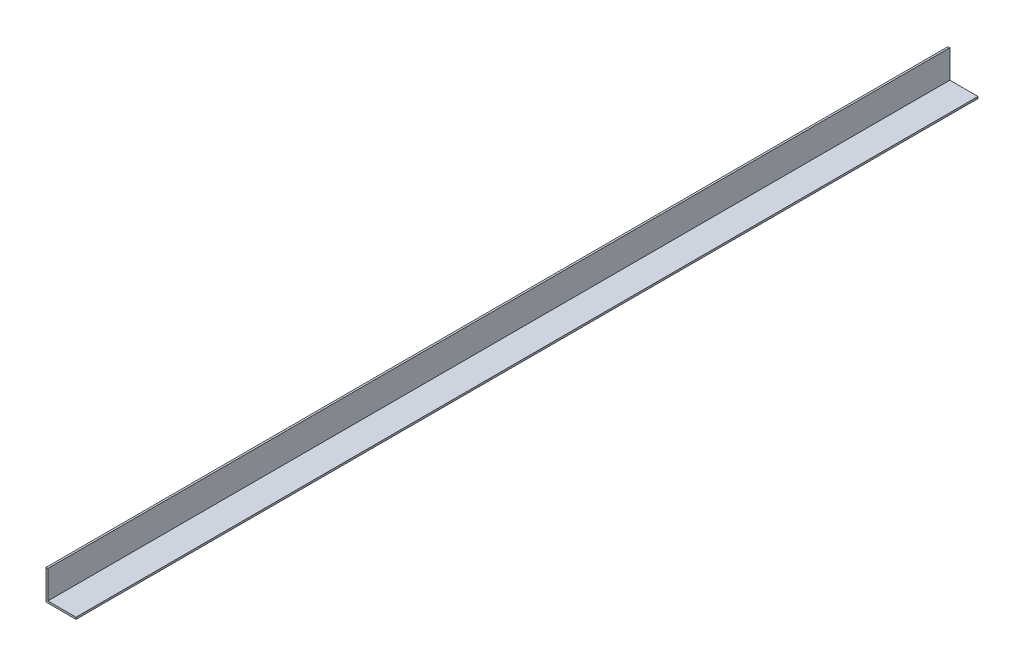
ISO-10303-21;
HEADER;
FILE_DESCRIPTION(('STEP AP214'),'2;1');
FILE_NAME('part.step','',(''),(''),'','','');
FILE_SCHEMA(('AUTOMOTIVE_DESIGN { 1 0 10303 214 1 1 1 1 }'));
ENDSEC;
DATA;
#1=APPLICATION_CONTEXT('core data for automotive mechanical design processes');
#2=APPLICATION_PROTOCOL_DEFINITION('international standard','automotive_design',2000,#1);
#3=PRODUCT_CONTEXT('',#1,'mechanical');
#4=PRODUCT('Part','Part','',(#3));
#5=PRODUCT_RELATED_PRODUCT_CATEGORY('part','',(#4));
#6=PRODUCT_DEFINITION_FORMATION('','',#4);
#7=PRODUCT_DEFINITION_CONTEXT('part definition',#1,'design');
#8=PRODUCT_DEFINITION('design','',#6,#7);
#9=PRODUCT_DEFINITION_SHAPE('','',#8);
#10=(LENGTH_UNIT() NAMED_UNIT(*) SI_UNIT(.MILLI.,.METRE.));
#11=(NAMED_UNIT(*) PLANE_ANGLE_UNIT() SI_UNIT($,.RADIAN.));
#12=(NAMED_UNIT(*) SI_UNIT($,.STERADIAN.) SOLID_ANGLE_UNIT());
#13=UNCERTAINTY_MEASURE_WITH_UNIT(LENGTH_MEASURE(1.E-05),#10,'distance_accuracy_value','');
#14=(GEOMETRIC_REPRESENTATION_CONTEXT(3) GLOBAL_UNCERTAINTY_ASSIGNED_CONTEXT((#13)) GLOBAL_UNIT_ASSIGNED_CONTEXT((#10,
#11,#12)) REPRESENTATION_CONTEXT('',''));
#15=CARTESIAN_POINT('',(0.,0.,0.));
#16=DIRECTION('',(0.,0.,1.));
#17=DIRECTION('',(1.,0.,0.));
#18=AXIS2_PLACEMENT_3D('',#15,#16,#17);
#19=CARTESIAN_POINT('',(12.7,203.,-6100.));
#20=DIRECTION('',(0.,1.,0.));
#21=DIRECTION('',(0.,0.,1.));
#22=AXIS2_PLACEMENT_3D('',#19,#20,#21);
#23=PLANE('',#22);
#24=DIRECTION('',(-1.,0.,0.));
#25=VECTOR('',#24,1.);
#26=CARTESIAN_POINT('',(12.7,203.,0.));
#27=LINE('',#26,#25);
#28=CARTESIAN_POINT('',(12.7,203.,0.));
#29=VERTEX_POINT('',#28);
#30=CARTESIAN_POINT('',(0.,203.,0.));
#31=VERTEX_POINT('',#30);
#32=EDGE_CURVE('E118',#29,#31,#27,.T.);
#33=ORIENTED_EDGE('',*,*,#32,.F.);
#34=DIRECTION('',(0.,0.,1.));
#35=VECTOR('',#34,1.);
#36=CARTESIAN_POINT('',(12.7,203.,-6100.));
#37=LINE('',#36,#35);
#38=CARTESIAN_POINT('',(12.7,203.,-6100.));
#39=VERTEX_POINT('',#38);
#40=EDGE_CURVE('E11',#39,#29,#37,.T.);
#41=ORIENTED_EDGE('',*,*,#40,.F.);
#42=DIRECTION('',(-1.,0.,0.));
#43=VECTOR('',#42,1.);
#44=CARTESIAN_POINT('',(12.7,203.,-6100.));
#45=LINE('',#44,#43);
#46=CARTESIAN_POINT('',(0.,203.,-6100.));
#47=VERTEX_POINT('',#46);
#48=EDGE_CURVE('E132',#39,#47,#45,.T.);
#49=ORIENTED_EDGE('',*,*,#48,.T.);
#50=DIRECTION('',(0.,0.,1.));
#51=VECTOR('',#50,1.);
#52=CARTESIAN_POINT('',(0.,203.,-6100.));
#53=LINE('',#52,#51);
#54=EDGE_CURVE('E36',#47,#31,#53,.T.);
#55=ORIENTED_EDGE('',*,*,#54,.T.);
#56=EDGE_LOOP('',(#33,#41,#49,#55));
#57=FACE_BOUND('',#56,.T.);
#58=ADVANCED_FACE('F33',(#57),#23,.T.);
#59=CARTESIAN_POINT('',(12.7,12.7,-6100.));
#60=DIRECTION('',(1.,0.,0.));
#61=DIRECTION('',(0.,1.,0.));
#62=AXIS2_PLACEMENT_3D('',#59,#60,#61);
#63=PLANE('',#62);
#64=DIRECTION('',(0.,1.,0.));
#65=VECTOR('',#64,1.);
#66=CARTESIAN_POINT('',(12.7,12.7,0.));
#67=LINE('',#66,#65);
#68=CARTESIAN_POINT('',(12.7,12.7,0.));
#69=VERTEX_POINT('',#68);
#70=EDGE_CURVE('E130',#69,#29,#67,.T.);
#71=ORIENTED_EDGE('',*,*,#70,.F.);
#72=DIRECTION('',(0.,0.,1.));
#73=VECTOR('',#72,1.);
#74=CARTESIAN_POINT('',(12.7,12.7,-6100.));
#75=LINE('',#74,#73);
#76=CARTESIAN_POINT('',(12.7,12.7,-6100.));
#77=VERTEX_POINT('',#76);
#78=EDGE_CURVE('E42',#77,#69,#75,.T.);
#79=ORIENTED_EDGE('',*,*,#78,.F.);
#80=DIRECTION('',(0.,1.,0.));
#81=VECTOR('',#80,1.);
#82=CARTESIAN_POINT('',(12.7,12.7,-6100.));
#83=LINE('',#82,#81);
#84=EDGE_CURVE('E108',#77,#39,#83,.T.);
#85=ORIENTED_EDGE('',*,*,#84,.T.);
#86=ORIENTED_EDGE('',*,*,#40,.T.);
#87=EDGE_LOOP('',(#71,#79,#85,#86));
#88=FACE_BOUND('',#87,.T.);
#89=ADVANCED_FACE('F140',(#88),#63,.T.);
#90=CARTESIAN_POINT('',(203.,12.7,-6100.));
#91=DIRECTION('',(0.,1.,0.));
#92=DIRECTION('',(-1.,0.,0.));
#93=AXIS2_PLACEMENT_3D('',#90,#91,#92);
#94=PLANE('',#93);
#95=DIRECTION('',(-1.,0.,0.));
#96=VECTOR('',#95,1.);
#97=CARTESIAN_POINT('',(203.,12.7,0.));
#98=LINE('',#97,#96);
#99=CARTESIAN_POINT('',(203.,12.7,0.));
#100=VERTEX_POINT('',#99);
#101=EDGE_CURVE('E95',#100,#69,#98,.T.);
#102=ORIENTED_EDGE('',*,*,#101,.F.);
#103=DIRECTION('',(0.,0.,1.));
#104=VECTOR('',#103,1.);
#105=CARTESIAN_POINT('',(203.,12.7,-6100.));
#106=LINE('',#105,#104);
#107=CARTESIAN_POINT('',(203.,12.7,-6100.));
#108=VERTEX_POINT('',#107);
#109=EDGE_CURVE('E90',#108,#100,#106,.T.);
#110=ORIENTED_EDGE('',*,*,#109,.F.);
#111=DIRECTION('',(-1.,0.,0.));
#112=VECTOR('',#111,1.);
#113=CARTESIAN_POINT('',(203.,12.7,-6100.));
#114=LINE('',#113,#112);
#115=EDGE_CURVE('E93',#108,#77,#114,.T.);
#116=ORIENTED_EDGE('',*,*,#115,.T.);
#117=ORIENTED_EDGE('',*,*,#78,.T.);
#118=EDGE_LOOP('',(#102,#110,#116,#117));
#119=FACE_BOUND('',#118,.T.);
#120=ADVANCED_FACE('F92',(#119),#94,.T.);
#121=CARTESIAN_POINT('',(203.,0.,-6100.));
#122=DIRECTION('',(1.,0.,0.));
#123=DIRECTION('',(0.,0.,-1.));
#124=AXIS2_PLACEMENT_3D('',#121,#122,#123);
#125=PLANE('',#124);
#126=DIRECTION('',(0.,1.,0.));
#127=VECTOR('',#126,1.);
#128=CARTESIAN_POINT('',(203.,0.,0.));
#129=LINE('',#128,#127);
#130=CARTESIAN_POINT('',(203.,0.,0.));
#131=VERTEX_POINT('',#130);
#132=EDGE_CURVE('E127',#131,#100,#129,.T.);
#133=ORIENTED_EDGE('',*,*,#132,.F.);
#134=DIRECTION('',(0.,0.,1.));
#135=VECTOR('',#134,1.);
#136=CARTESIAN_POINT('',(203.,0.,-6100.));
#137=LINE('',#136,#135);
#138=CARTESIAN_POINT('',(203.,0.,-6100.));
#139=VERTEX_POINT('',#138);
#140=EDGE_CURVE('E100',#139,#131,#137,.T.);
#141=ORIENTED_EDGE('',*,*,#140,.F.);
#142=DIRECTION('',(0.,1.,0.));
#143=VECTOR('',#142,1.);
#144=CARTESIAN_POINT('',(203.,0.,-6100.));
#145=LINE('',#144,#143);
#146=EDGE_CURVE('E106',#139,#108,#145,.T.);
#147=ORIENTED_EDGE('',*,*,#146,.T.);
#148=ORIENTED_EDGE('',*,*,#109,.T.);
#149=EDGE_LOOP('',(#133,#141,#147,#148));
#150=FACE_BOUND('',#149,.T.);
#151=ADVANCED_FACE('F110',(#150),#125,.T.);
#152=CARTESIAN_POINT('',(0.,0.,-6100.));
#153=DIRECTION('',(0.,-1.,0.));
#154=DIRECTION('',(0.,0.,-1.));
#155=AXIS2_PLACEMENT_3D('',#152,#153,#154);
#156=PLANE('',#155);
#157=DIRECTION('',(1.,0.,0.));
#158=VECTOR('',#157,1.);
#159=CARTESIAN_POINT('',(0.,0.,0.));
#160=LINE('',#159,#158);
#161=CARTESIAN_POINT('',(0.,0.,0.));
#162=VERTEX_POINT('',#161);
#163=EDGE_CURVE('E124',#162,#131,#160,.T.);
#164=ORIENTED_EDGE('',*,*,#163,.F.);
#165=DIRECTION('',(0.,0.,1.));
#166=VECTOR('',#165,1.);
#167=CARTESIAN_POINT('',(0.,0.,-6100.));
#168=LINE('',#167,#166);
#169=CARTESIAN_POINT('',(0.,0.,-6100.));
#170=VERTEX_POINT('',#169);
#171=EDGE_CURVE('E135',#170,#162,#168,.T.);
#172=ORIENTED_EDGE('',*,*,#171,.F.);
#173=DIRECTION('',(1.,0.,0.));
#174=VECTOR('',#173,1.);
#175=CARTESIAN_POINT('',(0.,0.,-6100.));
#176=LINE('',#175,#174);
#177=EDGE_CURVE('E111',#170,#139,#176,.T.);
#178=ORIENTED_EDGE('',*,*,#177,.T.);
#179=ORIENTED_EDGE('',*,*,#140,.T.);
#180=EDGE_LOOP('',(#164,#172,#178,#179));
#181=FACE_BOUND('',#180,.T.);
#182=ADVANCED_FACE('F153',(#181),#156,.T.);
#183=CARTESIAN_POINT('',(0.,203.,-6100.));
#184=DIRECTION('',(-1.,0.,0.));
#185=DIRECTION('',(0.,-1.,0.));
#186=AXIS2_PLACEMENT_3D('',#183,#184,#185);
#187=PLANE('',#186);
#188=DIRECTION('',(0.,-1.,0.));
#189=VECTOR('',#188,1.);
#190=CARTESIAN_POINT('',(0.,203.,0.));
#191=LINE('',#190,#189);
#192=EDGE_CURVE('E121',#31,#162,#191,.T.);
#193=ORIENTED_EDGE('',*,*,#192,.F.);
#194=ORIENTED_EDGE('',*,*,#54,.F.);
#195=DIRECTION('',(0.,-1.,0.));
#196=VECTOR('',#195,1.);
#197=CARTESIAN_POINT('',(0.,203.,-6100.));
#198=LINE('',#197,#196);
#199=EDGE_CURVE('E113',#47,#170,#198,.T.);
#200=ORIENTED_EDGE('',*,*,#199,.T.);
#201=ORIENTED_EDGE('',*,*,#171,.T.);
#202=EDGE_LOOP('',(#193,#194,#200,#201));
#203=FACE_BOUND('',#202,.T.);
#204=ADVANCED_FACE('F137',(#203),#187,.T.);
#205=CARTESIAN_POINT('',(0.,0.,-6100.));
#206=DIRECTION('',(0.,0.,1.));
#207=DIRECTION('',(1.,0.,0.));
#208=AXIS2_PLACEMENT_3D('',#205,#206,#207);
#209=PLANE('',#208);
#210=ORIENTED_EDGE('',*,*,#48,.F.);
#211=ORIENTED_EDGE('',*,*,#84,.F.);
#212=ORIENTED_EDGE('',*,*,#115,.F.);
#213=ORIENTED_EDGE('',*,*,#146,.F.);
#214=ORIENTED_EDGE('',*,*,#177,.F.);
#215=ORIENTED_EDGE('',*,*,#199,.F.);
#216=EDGE_LOOP('',(#210,#211,#212,#213,#214,#215));
#217=FACE_BOUND('',#216,.T.);
#218=ADVANCED_FACE('F104',(#217),#209,.F.);
#219=CARTESIAN_POINT('',(0.,0.,0.));
#220=DIRECTION('',(0.,0.,1.));
#221=DIRECTION('',(1.,0.,0.));
#222=AXIS2_PLACEMENT_3D('',#219,#220,#221);
#223=PLANE('',#222);
#224=ORIENTED_EDGE('',*,*,#32,.T.);
#225=ORIENTED_EDGE('',*,*,#192,.T.);
#226=ORIENTED_EDGE('',*,*,#163,.T.);
#227=ORIENTED_EDGE('',*,*,#132,.T.);
#228=ORIENTED_EDGE('',*,*,#101,.T.);
#229=ORIENTED_EDGE('',*,*,#70,.T.);
#230=EDGE_LOOP('',(#224,#225,#226,#227,#228,#229));
#231=FACE_BOUND('',#230,.T.);
#232=ADVANCED_FACE('F139',(#231),#223,.T.);
#233=CLOSED_SHELL('',(#58,#89,#120,#151,#182,#204,#218,#232));
#234=MANIFOLD_SOLID_BREP('B2',#233);
#235=ADVANCED_BREP_SHAPE_REPRESENTATION('',(#18,#234),#14);
#236=SHAPE_DEFINITION_REPRESENTATION(#9,#235);
ENDSEC;
END-ISO-10303-21;
